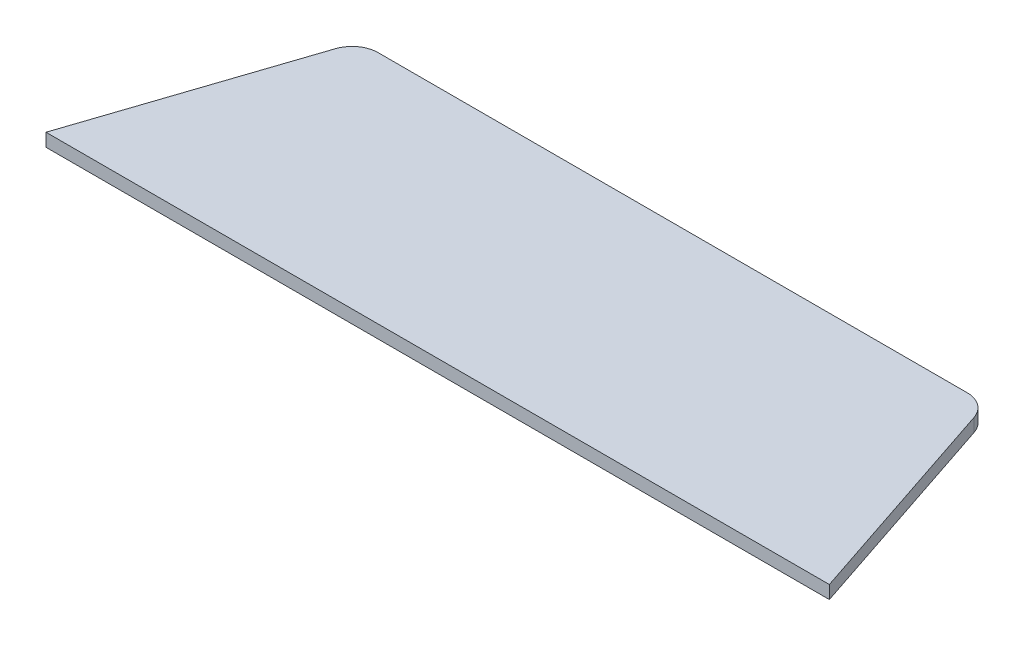
ISO-10303-21;
HEADER;
FILE_DESCRIPTION(('STEP AP214'),'2;1');
FILE_NAME('part.step','',(''),(''),'','','');
FILE_SCHEMA(('AUTOMOTIVE_DESIGN { 1 0 10303 214 1 1 1 1 }'));
ENDSEC;
DATA;
#1=APPLICATION_CONTEXT('core data for automotive mechanical design processes');
#2=APPLICATION_PROTOCOL_DEFINITION('international standard','automotive_design',2000,#1);
#3=PRODUCT_CONTEXT('',#1,'mechanical');
#4=PRODUCT('Part','Part','',(#3));
#5=PRODUCT_RELATED_PRODUCT_CATEGORY('part','',(#4));
#6=PRODUCT_DEFINITION_FORMATION('','',#4);
#7=PRODUCT_DEFINITION_CONTEXT('part definition',#1,'design');
#8=PRODUCT_DEFINITION('design','',#6,#7);
#9=PRODUCT_DEFINITION_SHAPE('','',#8);
#10=(LENGTH_UNIT() NAMED_UNIT(*) SI_UNIT(.MILLI.,.METRE.));
#11=(NAMED_UNIT(*) PLANE_ANGLE_UNIT() SI_UNIT($,.RADIAN.));
#12=(NAMED_UNIT(*) SI_UNIT($,.STERADIAN.) SOLID_ANGLE_UNIT());
#13=UNCERTAINTY_MEASURE_WITH_UNIT(LENGTH_MEASURE(1.E-05),#10,'distance_accuracy_value','');
#14=(GEOMETRIC_REPRESENTATION_CONTEXT(3) GLOBAL_UNCERTAINTY_ASSIGNED_CONTEXT((#13)) GLOBAL_UNIT_ASSIGNED_CONTEXT((#10,
#11,#12)) REPRESENTATION_CONTEXT('',''));
#15=CARTESIAN_POINT('',(0.,0.,0.));
#16=DIRECTION('',(0.,0.,1.));
#17=DIRECTION('',(1.,0.,0.));
#18=AXIS2_PLACEMENT_3D('',#15,#16,#17);
#19=CARTESIAN_POINT('',(0.,5.,0.));
#20=DIRECTION('',(0.,0.,-1.));
#21=DIRECTION('',(-1.,0.,0.));
#22=AXIS2_PLACEMENT_3D('',#19,#20,#21);
#23=PLANE('',#22);
#24=DIRECTION('',(1.,0.,0.));
#25=VECTOR('',#24,1.);
#26=CARTESIAN_POINT('',(0.,0.,0.));
#27=LINE('',#26,#25);
#28=CARTESIAN_POINT('',(0.,0.,0.));
#29=VERTEX_POINT('',#28);
#30=CARTESIAN_POINT('',(300.,0.,0.));
#31=VERTEX_POINT('',#30);
#32=EDGE_CURVE('E111',#29,#31,#27,.T.);
#33=ORIENTED_EDGE('',*,*,#32,.T.);
#34=DIRECTION('',(0.,-1.,0.));
#35=VECTOR('',#34,1.);
#36=CARTESIAN_POINT('',(300.,5.,0.));
#37=LINE('',#36,#35);
#38=CARTESIAN_POINT('',(300.,5.,0.));
#39=VERTEX_POINT('',#38);
#40=EDGE_CURVE('E96',#39,#31,#37,.T.);
#41=ORIENTED_EDGE('',*,*,#40,.F.);
#42=DIRECTION('',(1.,0.,0.));
#43=VECTOR('',#42,1.);
#44=CARTESIAN_POINT('',(0.,5.,0.));
#45=LINE('',#44,#43);
#46=CARTESIAN_POINT('',(0.,5.,0.));
#47=VERTEX_POINT('',#46);
#48=EDGE_CURVE('E100',#47,#39,#45,.T.);
#49=ORIENTED_EDGE('',*,*,#48,.F.);
#50=DIRECTION('',(0.,-1.,0.));
#51=VECTOR('',#50,1.);
#52=CARTESIAN_POINT('',(0.,5.,0.));
#53=LINE('',#52,#51);
#54=EDGE_CURVE('E113',#47,#29,#53,.T.);
#55=ORIENTED_EDGE('',*,*,#54,.T.);
#56=EDGE_LOOP('',(#33,#41,#49,#55));
#57=FACE_BOUND('',#56,.T.);
#58=ADVANCED_FACE('F39',(#57),#23,.F.);
#59=CARTESIAN_POINT('',(300.,5.,0.));
#60=DIRECTION('',(-0.948683298050514,0.,0.316227766016838));
#61=DIRECTION('',(0.316227766016838,0.,0.948683298050514));
#62=AXIS2_PLACEMENT_3D('',#59,#60,#61);
#63=PLANE('',#62);
#64=DIRECTION('',(-0.316227766016838,0.,-0.948683298050514));
#65=VECTOR('',#64,1.);
#66=CARTESIAN_POINT('',(300.,0.,0.));
#67=LINE('',#66,#65);
#68=CARTESIAN_POINT('',(272.279240779944,0.,-83.1622776601684));
#69=VERTEX_POINT('',#68);
#70=EDGE_CURVE('E139',#31,#69,#67,.T.);
#71=ORIENTED_EDGE('',*,*,#70,.T.);
#72=DIRECTION('',(0.,-1.,0.));
#73=VECTOR('',#72,1.);
#74=CARTESIAN_POINT('',(272.279240779944,5.,-83.1622776601684));
#75=LINE('',#74,#73);
#76=CARTESIAN_POINT('',(272.279240779944,5.,-83.1622776601684));
#77=VERTEX_POINT('',#76);
#78=EDGE_CURVE('E62',#69,#77,#75,.F.);
#79=ORIENTED_EDGE('',*,*,#78,.T.);
#80=DIRECTION('',(-0.316227766016838,0.,-0.948683298050514));
#81=VECTOR('',#80,1.);
#82=CARTESIAN_POINT('',(300.,5.,0.));
#83=LINE('',#82,#81);
#84=EDGE_CURVE('E92',#39,#77,#83,.T.);
#85=ORIENTED_EDGE('',*,*,#84,.F.);
#86=ORIENTED_EDGE('',*,*,#40,.T.);
#87=EDGE_LOOP('',(#71,#79,#85,#86));
#88=FACE_BOUND('',#87,.T.);
#89=ADVANCED_FACE('F94',(#88),#63,.F.);
#90=CARTESIAN_POINT('',(30.,5.,-90.));
#91=DIRECTION('',(0.,0.,1.));
#92=DIRECTION('',(1.,0.,0.));
#93=AXIS2_PLACEMENT_3D('',#90,#91,#92);
#94=PLANE('',#93);
#95=DIRECTION('',(-1.,0.,0.));
#96=VECTOR('',#95,1.);
#97=CARTESIAN_POINT('',(30.,5.,-90.));
#98=LINE('',#97,#96);
#99=CARTESIAN_POINT('',(262.792407799439,5.,-90.));
#100=VERTEX_POINT('',#99);
#101=CARTESIAN_POINT('',(37.2075922005612,5.,-90.));
#102=VERTEX_POINT('',#101);
#103=EDGE_CURVE('E99',#100,#102,#98,.T.);
#104=ORIENTED_EDGE('',*,*,#103,.F.);
#105=DIRECTION('',(0.,-1.,0.));
#106=VECTOR('',#105,1.);
#107=CARTESIAN_POINT('',(262.792407799439,5.,-90.));
#108=LINE('',#107,#106);
#109=CARTESIAN_POINT('',(262.792407799439,0.,-90.));
#110=VERTEX_POINT('',#109);
#111=EDGE_CURVE('E115',#100,#110,#108,.T.);
#112=ORIENTED_EDGE('',*,*,#111,.T.);
#113=DIRECTION('',(-1.,0.,0.));
#114=VECTOR('',#113,1.);
#115=CARTESIAN_POINT('',(30.,0.,-90.));
#116=LINE('',#115,#114);
#117=CARTESIAN_POINT('',(37.2075922005612,0.,-90.));
#118=VERTEX_POINT('',#117);
#119=EDGE_CURVE('E140',#110,#118,#116,.T.);
#120=ORIENTED_EDGE('',*,*,#119,.T.);
#121=DIRECTION('',(0.,-1.,0.));
#122=VECTOR('',#121,1.);
#123=CARTESIAN_POINT('',(37.2075922005612,5.,-90.));
#124=LINE('',#123,#122);
#125=EDGE_CURVE('E112',#118,#102,#124,.F.);
#126=ORIENTED_EDGE('',*,*,#125,.T.);
#127=EDGE_LOOP('',(#104,#112,#120,#126));
#128=FACE_BOUND('',#127,.T.);
#129=ADVANCED_FACE('F131',(#128),#94,.F.);
#130=CARTESIAN_POINT('',(0.,5.,0.));
#131=DIRECTION('',(0.948683298050514,0.,0.316227766016838));
#132=DIRECTION('',(0.316227766016838,0.,-0.948683298050514));
#133=AXIS2_PLACEMENT_3D('',#130,#131,#132);
#134=PLANE('',#133);
#135=DIRECTION('',(-0.316227766016838,0.,0.948683298050514));
#136=VECTOR('',#135,1.);
#137=CARTESIAN_POINT('',(0.,5.,0.));
#138=LINE('',#137,#136);
#139=CARTESIAN_POINT('',(27.7207592200561,5.,-83.1622776601684));
#140=VERTEX_POINT('',#139);
#141=EDGE_CURVE('E104',#140,#47,#138,.T.);
#142=ORIENTED_EDGE('',*,*,#141,.F.);
#143=DIRECTION('',(0.,-1.,0.));
#144=VECTOR('',#143,1.);
#145=CARTESIAN_POINT('',(27.7207592200561,5.,-83.1622776601684));
#146=LINE('',#145,#144);
#147=CARTESIAN_POINT('',(27.7207592200561,0.,-83.1622776601684));
#148=VERTEX_POINT('',#147);
#149=EDGE_CURVE('E11',#140,#148,#146,.T.);
#150=ORIENTED_EDGE('',*,*,#149,.T.);
#151=DIRECTION('',(-0.316227766016838,0.,0.948683298050514));
#152=VECTOR('',#151,1.);
#153=CARTESIAN_POINT('',(0.,0.,0.));
#154=LINE('',#153,#152);
#155=EDGE_CURVE('E108',#148,#29,#154,.T.);
#156=ORIENTED_EDGE('',*,*,#155,.T.);
#157=ORIENTED_EDGE('',*,*,#54,.F.);
#158=EDGE_LOOP('',(#142,#150,#156,#157));
#159=FACE_BOUND('',#158,.T.);
#160=ADVANCED_FACE('F147',(#159),#134,.F.);
#161=CARTESIAN_POINT('',(0.,5.,0.));
#162=DIRECTION('',(0.,1.,0.));
#163=DIRECTION('',(0.,0.,1.));
#164=AXIS2_PLACEMENT_3D('',#161,#162,#163);
#165=PLANE('',#164);
#166=ORIENTED_EDGE('',*,*,#84,.T.);
#167=CARTESIAN_POINT('',(262.792407799439,5.,-80.));
#168=DIRECTION('',(0.,1.,0.));
#169=DIRECTION('',(0.,0.,1.));
#170=AXIS2_PLACEMENT_3D('',#167,#168,#169);
#171=CIRCLE('',#170,10.);
#172=EDGE_CURVE('E47',#77,#100,#171,.T.);
#173=ORIENTED_EDGE('',*,*,#172,.T.);
#174=ORIENTED_EDGE('',*,*,#103,.T.);
#175=CARTESIAN_POINT('',(37.2075922005612,5.,-80.));
#176=DIRECTION('',(0.,1.,0.));
#177=DIRECTION('',(0.,0.,1.));
#178=AXIS2_PLACEMENT_3D('',#175,#176,#177);
#179=CIRCLE('',#178,10.);
#180=EDGE_CURVE('E54',#102,#140,#179,.T.);
#181=ORIENTED_EDGE('',*,*,#180,.T.);
#182=ORIENTED_EDGE('',*,*,#141,.T.);
#183=ORIENTED_EDGE('',*,*,#48,.T.);
#184=EDGE_LOOP('',(#166,#173,#174,#181,#182,#183));
#185=FACE_BOUND('',#184,.T.);
#186=ADVANCED_FACE('F103',(#185),#165,.T.);
#187=CARTESIAN_POINT('',(0.,0.,0.));
#188=DIRECTION('',(0.,1.,0.));
#189=DIRECTION('',(0.,0.,1.));
#190=AXIS2_PLACEMENT_3D('',#187,#188,#189);
#191=PLANE('',#190);
#192=ORIENTED_EDGE('',*,*,#119,.F.);
#193=CARTESIAN_POINT('',(262.792407799439,0.,-80.));
#194=DIRECTION('',(0.,1.,0.));
#195=DIRECTION('',(0.,0.,1.));
#196=AXIS2_PLACEMENT_3D('',#193,#194,#195);
#197=CIRCLE('',#196,10.);
#198=EDGE_CURVE('E124',#110,#69,#197,.F.);
#199=ORIENTED_EDGE('',*,*,#198,.T.);
#200=ORIENTED_EDGE('',*,*,#70,.F.);
#201=ORIENTED_EDGE('',*,*,#32,.F.);
#202=ORIENTED_EDGE('',*,*,#155,.F.);
#203=CARTESIAN_POINT('',(37.2075922005612,0.,-80.));
#204=DIRECTION('',(0.,1.,0.));
#205=DIRECTION('',(0.,0.,1.));
#206=AXIS2_PLACEMENT_3D('',#203,#204,#205);
#207=CIRCLE('',#206,10.);
#208=EDGE_CURVE('E122',#148,#118,#207,.F.);
#209=ORIENTED_EDGE('',*,*,#208,.T.);
#210=EDGE_LOOP('',(#192,#199,#200,#201,#202,#209));
#211=FACE_BOUND('',#210,.T.);
#212=ADVANCED_FACE('F138',(#211),#191,.F.);
#213=CARTESIAN_POINT('',(262.792407799439,5.,-80.));
#214=DIRECTION('',(0.,-1.,0.));
#215=DIRECTION('',(0.,0.,-1.));
#216=AXIS2_PLACEMENT_3D('',#213,#214,#215);
#217=CYLINDRICAL_SURFACE('',#216,10.);
#218=ORIENTED_EDGE('',*,*,#172,.F.);
#219=ORIENTED_EDGE('',*,*,#78,.F.);
#220=ORIENTED_EDGE('',*,*,#198,.F.);
#221=ORIENTED_EDGE('',*,*,#111,.F.);
#222=EDGE_LOOP('',(#218,#219,#220,#221));
#223=FACE_BOUND('',#222,.T.);
#224=ADVANCED_FACE('F136',(#223),#217,.T.);
#225=CARTESIAN_POINT('',(37.2075922005612,5.,-80.));
#226=DIRECTION('',(0.,-1.,0.));
#227=DIRECTION('',(0.,0.,-1.));
#228=AXIS2_PLACEMENT_3D('',#225,#226,#227);
#229=CYLINDRICAL_SURFACE('',#228,10.);
#230=ORIENTED_EDGE('',*,*,#180,.F.);
#231=ORIENTED_EDGE('',*,*,#125,.F.);
#232=ORIENTED_EDGE('',*,*,#208,.F.);
#233=ORIENTED_EDGE('',*,*,#149,.F.);
#234=EDGE_LOOP('',(#230,#231,#232,#233));
#235=FACE_BOUND('',#234,.T.);
#236=ADVANCED_FACE('F41',(#235),#229,.T.);
#237=CLOSED_SHELL('',(#58,#89,#129,#160,#186,#212,#224,#236));
#238=MANIFOLD_SOLID_BREP('B2',#237);
#239=ADVANCED_BREP_SHAPE_REPRESENTATION('',(#18,#238),#14);
#240=SHAPE_DEFINITION_REPRESENTATION(#9,#239);
ENDSEC;
END-ISO-10303-21;
